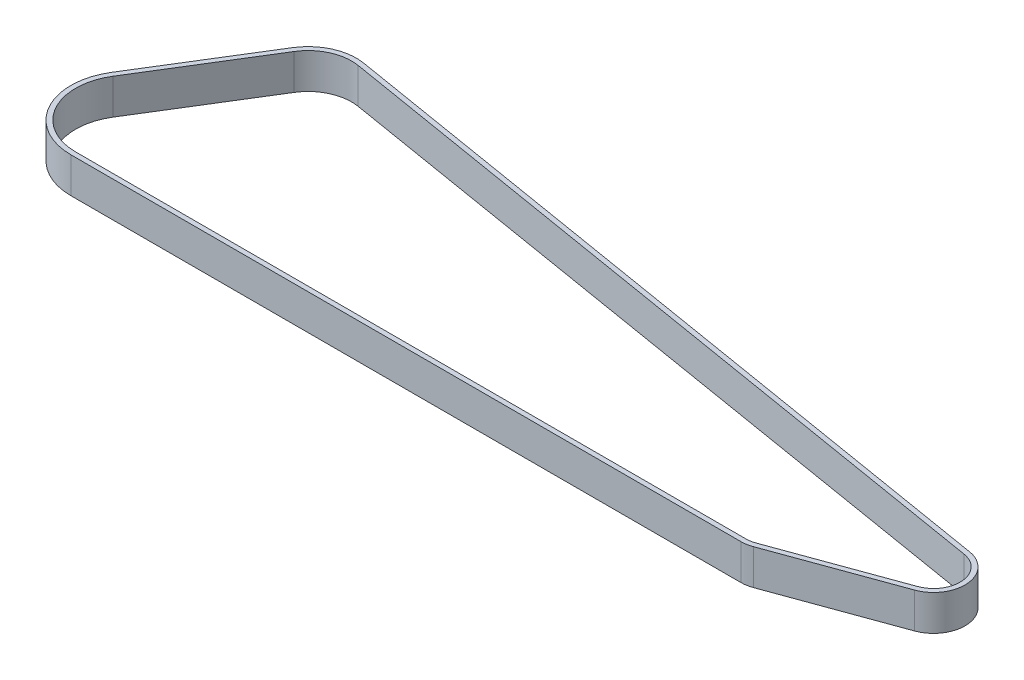
ISO-10303-21;
HEADER;
FILE_DESCRIPTION(('STEP AP214'),'2;1');
FILE_NAME('part.step','',(''),(''),'','','');
FILE_SCHEMA(('AUTOMOTIVE_DESIGN { 1 0 10303 214 1 1 1 1 }'));
ENDSEC;
DATA;
#1=APPLICATION_CONTEXT('core data for automotive mechanical design processes');
#2=APPLICATION_PROTOCOL_DEFINITION('international standard','automotive_design',2000,#1);
#3=PRODUCT_CONTEXT('',#1,'mechanical');
#4=PRODUCT('Part','Part','',(#3));
#5=PRODUCT_RELATED_PRODUCT_CATEGORY('part','',(#4));
#6=PRODUCT_DEFINITION_FORMATION('','',#4);
#7=PRODUCT_DEFINITION_CONTEXT('part definition',#1,'design');
#8=PRODUCT_DEFINITION('design','',#6,#7);
#9=PRODUCT_DEFINITION_SHAPE('','',#8);
#10=(LENGTH_UNIT() NAMED_UNIT(*) SI_UNIT(.MILLI.,.METRE.));
#11=(NAMED_UNIT(*) PLANE_ANGLE_UNIT() SI_UNIT($,.RADIAN.));
#12=(NAMED_UNIT(*) SI_UNIT($,.STERADIAN.) SOLID_ANGLE_UNIT());
#13=UNCERTAINTY_MEASURE_WITH_UNIT(LENGTH_MEASURE(1.E-05),#10,'distance_accuracy_value','');
#14=(GEOMETRIC_REPRESENTATION_CONTEXT(3) GLOBAL_UNCERTAINTY_ASSIGNED_CONTEXT((#13)) GLOBAL_UNIT_ASSIGNED_CONTEXT((#10,
#11,#12)) REPRESENTATION_CONTEXT('',''));
#15=CARTESIAN_POINT('',(0.,0.,0.));
#16=DIRECTION('',(0.,0.,1.));
#17=DIRECTION('',(1.,0.,0.));
#18=AXIS2_PLACEMENT_3D('',#15,#16,#17);
#19=CARTESIAN_POINT('',(-31.4527159951166,13.,-57.1021781318678));
#20=DIRECTION('',(-0.163389454989406,0.,0.98656164835162));
#21=DIRECTION('',(0.98656164835162,0.,0.163389454989406));
#22=AXIS2_PLACEMENT_3D('',#19,#20,#21);
#23=PLANE('',#22);
#24=DIRECTION('',(-0.98656164835162,0.,-0.163389454989406));
#25=VECTOR('',#24,1.);
#26=CARTESIAN_POINT('',(-31.4527159951166,4.,-57.1021781318678));
#27=LINE('',#26,#25);
#28=CARTESIAN_POINT('',(152.852878821178,4.,-26.5783981543595));
#29=VERTEX_POINT('',#28);
#30=CARTESIAN_POINT('',(-31.4474153331799,4.,-57.1013002624854));
#31=VERTEX_POINT('',#30);
#32=EDGE_CURVE('E156',#29,#31,#27,.T.);
#33=ORIENTED_EDGE('',*,*,#32,.F.);
#34=DIRECTION('',(0.,-1.,0.));
#35=VECTOR('',#34,1.);
#36=CARTESIAN_POINT('',(152.852878821178,13.,-26.5783981543595));
#37=LINE('',#36,#35);
#38=CARTESIAN_POINT('',(152.852878821178,13.,-26.5783981543595));
#39=VERTEX_POINT('',#38);
#40=EDGE_CURVE('E165',#39,#29,#37,.T.);
#41=ORIENTED_EDGE('',*,*,#40,.F.);
#42=DIRECTION('',(-0.98656164835162,0.,-0.163389454989406));
#43=VECTOR('',#42,1.);
#44=CARTESIAN_POINT('',(-31.4527159951166,13.,-57.1021781318678));
#45=LINE('',#44,#43);
#46=CARTESIAN_POINT('',(-31.4527159951166,13.,-57.1021781318678));
#47=VERTEX_POINT('',#46);
#48=EDGE_CURVE('E179',#39,#47,#45,.T.);
#49=ORIENTED_EDGE('',*,*,#48,.T.);
#50=DIRECTION('',(0.,-1.,0.));
#51=VECTOR('',#50,1.);
#52=CARTESIAN_POINT('',(-31.4527159951166,13.,-57.1021781318678));
#53=LINE('',#52,#51);
#54=CARTESIAN_POINT('',(-31.4527159951166,4.,-57.1021781318678));
#55=VERTEX_POINT('',#54);
#56=EDGE_CURVE('E175',#47,#55,#53,.T.);
#57=ORIENTED_EDGE('',*,*,#56,.T.);
#58=CARTESIAN_POINT('',(-33.25,4.,-46.25));
#59=DIRECTION('',(0.,1.,0.));
#60=DIRECTION('',(0.,0.,1.));
#61=AXIS2_PLACEMENT_3D('',#58,#59,#60);
#62=CIRCLE('',#61,11.);
#63=EDGE_CURVE('E162',#31,#55,#62,.T.);
#64=ORIENTED_EDGE('',*,*,#63,.F.);
#65=EDGE_LOOP('',(#33,#41,#49,#57,#64));
#66=FACE_BOUND('',#65,.T.);
#67=ADVANCED_FACE('F41',(#66),#23,.T.);
#68=CARTESIAN_POINT('',(-33.25,13.,-46.25));
#69=DIRECTION('',(0.,1.,0.));
#70=DIRECTION('',(0.,0.,1.));
#71=AXIS2_PLACEMENT_3D('',#68,#69,#70);
#72=PLANE('',#71);
#73=CARTESIAN_POINT('',(-33.25,13.,-46.25));
#74=DIRECTION('',(0.,1.,0.));
#75=DIRECTION('',(0.,0.,1.));
#76=AXIS2_PLACEMENT_3D('',#73,#74,#75);
#77=CIRCLE('',#76,12.23);
#78=CARTESIAN_POINT('',(-31.2517469654796,13.,-58.3156489593403));
#79=VERTEX_POINT('',#78);
#80=CARTESIAN_POINT('',(-43.6558013051858,13.,-52.6759006525929));
#81=VERTEX_POINT('',#80);
#82=EDGE_CURVE('E197',#79,#81,#77,.T.);
#83=ORIENTED_EDGE('',*,*,#82,.T.);
#84=DIRECTION('',(-0.525421149026402,0.,0.850842298052803));
#85=VECTOR('',#84,1.);
#86=CARTESIAN_POINT('',(-61.2083281993442,13.,-24.2521640996721));
#87=LINE('',#86,#85);
#88=CARTESIAN_POINT('',(-61.2083281993442,13.,-24.2521640996721));
#89=VERTEX_POINT('',#88);
#90=EDGE_CURVE('E200',#81,#89,#87,.T.);
#91=ORIENTED_EDGE('',*,*,#90,.T.);
#92=CARTESIAN_POINT('',(-48.25,13.,-16.25));
#93=DIRECTION('',(0.,1.,0.));
#94=DIRECTION('',(0.,0.,1.));
#95=AXIS2_PLACEMENT_3D('',#92,#93,#94);
#96=CIRCLE('',#95,15.23);
#97=CARTESIAN_POINT('',(-48.25,13.,-1.02));
#98=VERTEX_POINT('',#97);
#99=EDGE_CURVE('E202',#89,#98,#96,.T.);
#100=ORIENTED_EDGE('',*,*,#99,.T.);
#101=DIRECTION('',(1.,0.,0.));
#102=VECTOR('',#101,1.);
#103=CARTESIAN_POINT('',(-48.25,13.,-1.02));
#104=LINE('',#103,#102);
#105=CARTESIAN_POINT('',(121.75,13.,-1.01999999999996));
#106=VERTEX_POINT('',#105);
#107=EDGE_CURVE('E204',#98,#106,#104,.T.);
#108=ORIENTED_EDGE('',*,*,#107,.T.);
#109=CARTESIAN_POINT('',(121.75,13.,-9.));
#110=DIRECTION('',(0.,1.,0.));
#111=DIRECTION('',(0.,0.,1.));
#112=AXIS2_PLACEMENT_3D('',#109,#110,#111);
#113=CIRCLE('',#112,7.98000000000004);
#114=CARTESIAN_POINT('',(124.479320743739,13.,-1.50125288612843));
#115=VERTEX_POINT('',#114);
#116=EDGE_CURVE('E206',#106,#115,#113,.T.);
#117=ORIENTED_EDGE('',*,*,#116,.T.);
#118=DIRECTION('',(0.939692620785908,0.,-0.34202014332567));
#119=VECTOR('',#118,1.);
#120=CARTESIAN_POINT('',(154.479320743739,13.,-12.4203599141146));
#121=LINE('',#120,#119);
#122=CARTESIAN_POINT('',(154.479320743739,13.,-12.4203599141146));
#123=VERTEX_POINT('',#122);
#124=EDGE_CURVE('E208',#115,#123,#121,.T.);
#125=ORIENTED_EDGE('',*,*,#124,.T.);
#126=CARTESIAN_POINT('',(151.75,13.,-19.9191070279861));
#127=DIRECTION('',(0.,1.,0.));
#128=DIRECTION('',(0.,0.,1.));
#129=AXIS2_PLACEMENT_3D('',#126,#127,#128);
#130=CIRCLE('',#129,7.98000000000001);
#131=CARTESIAN_POINT('',(153.053847850816,13.,-27.791868981832));
#132=VERTEX_POINT('',#131);
#133=EDGE_CURVE('E210',#123,#132,#130,.T.);
#134=ORIENTED_EDGE('',*,*,#133,.T.);
#135=DIRECTION('',(-0.98656164835162,0.,-0.163389454989406));
#136=VECTOR('',#135,1.);
#137=CARTESIAN_POINT('',(-31.2517469654796,13.,-58.3156489593403));
#138=LINE('',#137,#136);
#139=EDGE_CURVE('E212',#132,#79,#138,.T.);
#140=ORIENTED_EDGE('',*,*,#139,.T.);
#141=EDGE_LOOP('',(#83,#91,#100,#108,#117,#125,#134,#140));
#142=FACE_BOUND('',#141,.T.);
#143=DIRECTION('',(-0.525421149026402,0.,0.850842298052804));
#144=VECTOR('',#143,1.);
#145=CARTESIAN_POINT('',(-60.1617921727393,13.,-23.6058960863696));
#146=LINE('',#145,#144);
#147=CARTESIAN_POINT('',(-42.6092652785808,13.,-52.0296326392904));
#148=VERTEX_POINT('',#147);
#149=CARTESIAN_POINT('',(-60.1617921727393,13.,-23.6058960863696));
#150=VERTEX_POINT('',#149);
#151=EDGE_CURVE('E263',#148,#150,#146,.T.);
#152=ORIENTED_EDGE('',*,*,#151,.F.);
#153=CARTESIAN_POINT('',(-33.25,13.,-46.25));
#154=DIRECTION('',(0.,1.,0.));
#155=DIRECTION('',(0.,0.,1.));
#156=AXIS2_PLACEMENT_3D('',#153,#154,#155);
#157=CIRCLE('',#156,11.);
#158=EDGE_CURVE('E261',#47,#148,#157,.T.);
#159=ORIENTED_EDGE('',*,*,#158,.F.);
#160=ORIENTED_EDGE('',*,*,#48,.F.);
#161=CARTESIAN_POINT('',(151.75,13.,-19.9191070279861));
#162=DIRECTION('',(0.,1.,0.));
#163=DIRECTION('',(0.,0.,1.));
#164=AXIS2_PLACEMENT_3D('',#161,#162,#163);
#165=CIRCLE('',#164,6.75000000000001);
#166=CARTESIAN_POINT('',(154.058635967448,13.,-13.5761818376812));
#167=VERTEX_POINT('',#166);
#168=EDGE_CURVE('E172',#167,#39,#165,.T.);
#169=ORIENTED_EDGE('',*,*,#168,.F.);
#170=DIRECTION('',(0.939692620785908,0.,-0.34202014332567));
#171=VECTOR('',#170,1.);
#172=CARTESIAN_POINT('',(154.058635967448,13.,-13.5761818376812));
#173=LINE('',#172,#171);
#174=CARTESIAN_POINT('',(124.058635967448,13.,-2.6570748096951));
#175=VERTEX_POINT('',#174);
#176=EDGE_CURVE('E276',#175,#167,#173,.T.);
#177=ORIENTED_EDGE('',*,*,#176,.F.);
#178=CARTESIAN_POINT('',(121.75,13.,-9.));
#179=DIRECTION('',(0.,1.,0.));
#180=DIRECTION('',(0.,0.,1.));
#181=AXIS2_PLACEMENT_3D('',#178,#179,#180);
#182=CIRCLE('',#181,6.75000000000001);
#183=CARTESIAN_POINT('',(121.75,13.,-2.24999999999999));
#184=VERTEX_POINT('',#183);
#185=EDGE_CURVE('E274',#184,#175,#182,.T.);
#186=ORIENTED_EDGE('',*,*,#185,.F.);
#187=DIRECTION('',(1.,0.,0.));
#188=VECTOR('',#187,1.);
#189=CARTESIAN_POINT('',(-48.25,13.,-2.25));
#190=LINE('',#189,#188);
#191=CARTESIAN_POINT('',(-48.25,13.,-2.25));
#192=VERTEX_POINT('',#191);
#193=EDGE_CURVE('E272',#192,#184,#190,.T.);
#194=ORIENTED_EDGE('',*,*,#193,.F.);
#195=CARTESIAN_POINT('',(-48.25,13.,-16.25));
#196=DIRECTION('',(0.,1.,0.));
#197=DIRECTION('',(0.,0.,1.));
#198=AXIS2_PLACEMENT_3D('',#195,#196,#197);
#199=CIRCLE('',#198,14.);
#200=EDGE_CURVE('E265',#150,#192,#199,.T.);
#201=ORIENTED_EDGE('',*,*,#200,.F.);
#202=EDGE_LOOP('',(#152,#159,#160,#169,#177,#186,#194,#201));
#203=FACE_BOUND('',#202,.T.);
#204=ADVANCED_FACE('F278',(#142,#203),#72,.T.);
#205=CARTESIAN_POINT('',(-33.25,13.,-46.25));
#206=DIRECTION('',(0.,-1.,0.));
#207=DIRECTION('',(0.,0.,-1.));
#208=AXIS2_PLACEMENT_3D('',#205,#206,#207);
#209=CYLINDRICAL_SURFACE('',#208,12.23);
#210=DIRECTION('',(0.,-1.,0.));
#211=VECTOR('',#210,1.);
#212=CARTESIAN_POINT('',(-31.2517469654796,13.,-58.3156489593403));
#213=LINE('',#212,#211);
#214=CARTESIAN_POINT('',(-31.2517469654796,4.,-58.3156489593403));
#215=VERTEX_POINT('',#214);
#216=EDGE_CURVE('E214',#79,#215,#213,.T.);
#217=ORIENTED_EDGE('',*,*,#216,.T.);
#218=CARTESIAN_POINT('',(-33.25,4.,-46.25));
#219=DIRECTION('',(0.,1.,0.));
#220=DIRECTION('',(0.,0.,1.));
#221=AXIS2_PLACEMENT_3D('',#218,#219,#220);
#222=CIRCLE('',#221,12.23);
#223=CARTESIAN_POINT('',(-43.6558013051858,4.,-52.6759006525929));
#224=VERTEX_POINT('',#223);
#225=EDGE_CURVE('E56',#215,#224,#222,.T.);
#226=ORIENTED_EDGE('',*,*,#225,.T.);
#227=DIRECTION('',(0.,-1.,0.));
#228=VECTOR('',#227,1.);
#229=CARTESIAN_POINT('',(-43.6558013051858,13.,-52.6759006525929));
#230=LINE('',#229,#228);
#231=EDGE_CURVE('E235',#81,#224,#230,.T.);
#232=ORIENTED_EDGE('',*,*,#231,.F.);
#233=ORIENTED_EDGE('',*,*,#82,.F.);
#234=EDGE_LOOP('',(#217,#226,#232,#233));
#235=FACE_BOUND('',#234,.T.);
#236=ADVANCED_FACE('F43',(#235),#209,.T.);
#237=CARTESIAN_POINT('',(-61.2083281993442,13.,-24.2521640996721));
#238=DIRECTION('',(0.850842298052804,0.,0.525421149026402));
#239=DIRECTION('',(0.525421149026402,0.,-0.850842298052804));
#240=AXIS2_PLACEMENT_3D('',#237,#238,#239);
#241=PLANE('',#240);
#242=ORIENTED_EDGE('',*,*,#231,.T.);
#243=DIRECTION('',(-0.525421149026402,0.,0.850842298052804));
#244=VECTOR('',#243,1.);
#245=CARTESIAN_POINT('',(-61.2083281993442,4.,-24.2521640996721));
#246=LINE('',#245,#244);
#247=CARTESIAN_POINT('',(-61.2083281993442,4.,-24.2521640996721));
#248=VERTEX_POINT('',#247);
#249=EDGE_CURVE('E267',#224,#248,#246,.T.);
#250=ORIENTED_EDGE('',*,*,#249,.T.);
#251=DIRECTION('',(0.,-1.,0.));
#252=VECTOR('',#251,1.);
#253=CARTESIAN_POINT('',(-61.2083281993442,13.,-24.2521640996721));
#254=LINE('',#253,#252);
#255=EDGE_CURVE('E232',#89,#248,#254,.T.);
#256=ORIENTED_EDGE('',*,*,#255,.F.);
#257=ORIENTED_EDGE('',*,*,#90,.F.);
#258=EDGE_LOOP('',(#242,#250,#256,#257));
#259=FACE_BOUND('',#258,.T.);
#260=ADVANCED_FACE('F417',(#259),#241,.F.);
#261=CARTESIAN_POINT('',(-48.25,13.,-16.25));
#262=DIRECTION('',(0.,-1.,0.));
#263=DIRECTION('',(0.,0.,-1.));
#264=AXIS2_PLACEMENT_3D('',#261,#262,#263);
#265=CYLINDRICAL_SURFACE('',#264,15.23);
#266=ORIENTED_EDGE('',*,*,#255,.T.);
#267=CARTESIAN_POINT('',(-48.25,4.,-16.25));
#268=DIRECTION('',(0.,1.,0.));
#269=DIRECTION('',(0.,0.,1.));
#270=AXIS2_PLACEMENT_3D('',#267,#268,#269);
#271=CIRCLE('',#270,15.23);
#272=CARTESIAN_POINT('',(-48.25,4.,-1.02));
#273=VERTEX_POINT('',#272);
#274=EDGE_CURVE('E238',#273,#248,#271,.F.);
#275=ORIENTED_EDGE('',*,*,#274,.F.);
#276=DIRECTION('',(0.,-1.,0.));
#277=VECTOR('',#276,1.);
#278=CARTESIAN_POINT('',(-48.25,13.,-1.02));
#279=LINE('',#278,#277);
#280=EDGE_CURVE('E229',#98,#273,#279,.T.);
#281=ORIENTED_EDGE('',*,*,#280,.F.);
#282=ORIENTED_EDGE('',*,*,#99,.F.);
#283=EDGE_LOOP('',(#266,#275,#281,#282));
#284=FACE_BOUND('',#283,.T.);
#285=ADVANCED_FACE('F408',(#284),#265,.T.);
#286=CARTESIAN_POINT('',(-48.25,13.,-1.02));
#287=DIRECTION('',(0.,0.,-1.));
#288=DIRECTION('',(-1.,0.,0.));
#289=AXIS2_PLACEMENT_3D('',#286,#287,#288);
#290=PLANE('',#289);
#291=DIRECTION('',(-1.,0.,0.));
#292=VECTOR('',#291,1.);
#293=CARTESIAN_POINT('',(0.,4.,-1.01999999999999));
#294=LINE('',#293,#292);
#295=CARTESIAN_POINT('',(121.75,4.,-1.01999999999996));
#296=VERTEX_POINT('',#295);
#297=EDGE_CURVE('E243',#296,#273,#294,.T.);
#298=ORIENTED_EDGE('',*,*,#297,.F.);
#299=DIRECTION('',(0.,-1.,0.));
#300=VECTOR('',#299,1.);
#301=CARTESIAN_POINT('',(121.75,13.,-1.01999999999996));
#302=LINE('',#301,#300);
#303=EDGE_CURVE('E226',#106,#296,#302,.T.);
#304=ORIENTED_EDGE('',*,*,#303,.F.);
#305=ORIENTED_EDGE('',*,*,#107,.F.);
#306=ORIENTED_EDGE('',*,*,#280,.T.);
#307=EDGE_LOOP('',(#298,#304,#305,#306));
#308=FACE_BOUND('',#307,.T.);
#309=ADVANCED_FACE('F399',(#308),#290,.F.);
#310=CARTESIAN_POINT('',(121.75,13.,-9.));
#311=DIRECTION('',(0.,-1.,0.));
#312=DIRECTION('',(0.,0.,-1.));
#313=AXIS2_PLACEMENT_3D('',#310,#311,#312);
#314=CYLINDRICAL_SURFACE('',#313,7.98000000000004);
#315=ORIENTED_EDGE('',*,*,#303,.T.);
#316=CARTESIAN_POINT('',(121.75,4.,-9.));
#317=DIRECTION('',(0.,1.,0.));
#318=DIRECTION('',(0.,0.,1.));
#319=AXIS2_PLACEMENT_3D('',#316,#317,#318);
#320=CIRCLE('',#319,7.98000000000004);
#321=CARTESIAN_POINT('',(124.479320743739,4.,-1.50125288612843));
#322=VERTEX_POINT('',#321);
#323=EDGE_CURVE('E467',#296,#322,#320,.T.);
#324=ORIENTED_EDGE('',*,*,#323,.T.);
#325=DIRECTION('',(0.,-1.,0.));
#326=VECTOR('',#325,1.);
#327=CARTESIAN_POINT('',(124.479320743739,13.,-1.50125288612843));
#328=LINE('',#327,#326);
#329=EDGE_CURVE('E223',#115,#322,#328,.T.);
#330=ORIENTED_EDGE('',*,*,#329,.F.);
#331=ORIENTED_EDGE('',*,*,#116,.F.);
#332=EDGE_LOOP('',(#315,#324,#330,#331));
#333=FACE_BOUND('',#332,.T.);
#334=ADVANCED_FACE('F390',(#333),#314,.T.);
#335=CARTESIAN_POINT('',(154.479320743739,13.,-12.4203599141146));
#336=DIRECTION('',(-0.34202014332567,0.,-0.939692620785908));
#337=DIRECTION('',(-0.939692620785908,0.,0.34202014332567));
#338=AXIS2_PLACEMENT_3D('',#335,#336,#337);
#339=PLANE('',#338);
#340=ORIENTED_EDGE('',*,*,#329,.T.);
#341=DIRECTION('',(0.939692620785908,0.,-0.34202014332567));
#342=VECTOR('',#341,1.);
#343=CARTESIAN_POINT('',(154.479320743739,4.,-12.4203599141146));
#344=LINE('',#343,#342);
#345=CARTESIAN_POINT('',(154.479320743739,4.,-12.4203599141146));
#346=VERTEX_POINT('',#345);
#347=EDGE_CURVE('E462',#322,#346,#344,.T.);
#348=ORIENTED_EDGE('',*,*,#347,.T.);
#349=DIRECTION('',(0.,-1.,0.));
#350=VECTOR('',#349,1.);
#351=CARTESIAN_POINT('',(154.479320743739,13.,-12.4203599141146));
#352=LINE('',#351,#350);
#353=EDGE_CURVE('E220',#123,#346,#352,.T.);
#354=ORIENTED_EDGE('',*,*,#353,.F.);
#355=ORIENTED_EDGE('',*,*,#124,.F.);
#356=EDGE_LOOP('',(#340,#348,#354,#355));
#357=FACE_BOUND('',#356,.T.);
#358=ADVANCED_FACE('F381',(#357),#339,.F.);
#359=CARTESIAN_POINT('',(151.75,13.,-19.9191070279861));
#360=DIRECTION('',(0.,-1.,0.));
#361=DIRECTION('',(0.,0.,-1.));
#362=AXIS2_PLACEMENT_3D('',#359,#360,#361);
#363=CYLINDRICAL_SURFACE('',#362,7.98000000000001);
#364=ORIENTED_EDGE('',*,*,#353,.T.);
#365=CARTESIAN_POINT('',(151.75,4.,-19.9191070279861));
#366=DIRECTION('',(0.,1.,0.));
#367=DIRECTION('',(0.,0.,1.));
#368=AXIS2_PLACEMENT_3D('',#365,#366,#367);
#369=CIRCLE('',#368,7.98000000000001);
#370=CARTESIAN_POINT('',(153.053847850816,4.,-27.791868981832));
#371=VERTEX_POINT('',#370);
#372=EDGE_CURVE('E460',#346,#371,#369,.T.);
#373=ORIENTED_EDGE('',*,*,#372,.T.);
#374=DIRECTION('',(0.,-1.,0.));
#375=VECTOR('',#374,1.);
#376=CARTESIAN_POINT('',(153.053847850816,13.,-27.791868981832));
#377=LINE('',#376,#375);
#378=EDGE_CURVE('E217',#132,#371,#377,.T.);
#379=ORIENTED_EDGE('',*,*,#378,.F.);
#380=ORIENTED_EDGE('',*,*,#133,.F.);
#381=EDGE_LOOP('',(#364,#373,#379,#380));
#382=FACE_BOUND('',#381,.T.);
#383=ADVANCED_FACE('F372',(#382),#363,.T.);
#384=CARTESIAN_POINT('',(-31.2517469654796,13.,-58.3156489593403));
#385=DIRECTION('',(-0.163389454989406,0.,0.98656164835162));
#386=DIRECTION('',(0.98656164835162,0.,0.163389454989406));
#387=AXIS2_PLACEMENT_3D('',#384,#385,#386);
#388=PLANE('',#387);
#389=ORIENTED_EDGE('',*,*,#378,.T.);
#390=DIRECTION('',(-0.98656164835162,0.,-0.163389454989406));
#391=VECTOR('',#390,1.);
#392=CARTESIAN_POINT('',(-31.2517469654796,4.,-58.3156489593403));
#393=LINE('',#392,#391);
#394=EDGE_CURVE('E168',#371,#215,#393,.T.);
#395=ORIENTED_EDGE('',*,*,#394,.T.);
#396=ORIENTED_EDGE('',*,*,#216,.F.);
#397=ORIENTED_EDGE('',*,*,#139,.F.);
#398=EDGE_LOOP('',(#389,#395,#396,#397));
#399=FACE_BOUND('',#398,.T.);
#400=ADVANCED_FACE('F364',(#399),#388,.F.);
#401=CARTESIAN_POINT('',(-33.25,13.,-46.25));
#402=DIRECTION('',(0.,-1.,0.));
#403=DIRECTION('',(0.,0.,-1.));
#404=AXIS2_PLACEMENT_3D('',#401,#402,#403);
#405=CYLINDRICAL_SURFACE('',#404,11.);
#406=DIRECTION('',(0.,-1.,0.));
#407=VECTOR('',#406,1.);
#408=CARTESIAN_POINT('',(-42.6092652785808,13.,-52.0296326392904));
#409=LINE('',#408,#407);
#410=CARTESIAN_POINT('',(-42.6092652785808,4.,-52.0296326392904));
#411=VERTEX_POINT('',#410);
#412=EDGE_CURVE('E194',#148,#411,#409,.T.);
#413=ORIENTED_EDGE('',*,*,#412,.T.);
#414=CARTESIAN_POINT('',(-33.25,4.,-46.25));
#415=DIRECTION('',(0.,1.,0.));
#416=DIRECTION('',(0.,0.,1.));
#417=AXIS2_PLACEMENT_3D('',#414,#415,#416);
#418=CIRCLE('',#417,11.);
#419=EDGE_CURVE('E240',#411,#55,#418,.F.);
#420=ORIENTED_EDGE('',*,*,#419,.T.);
#421=ORIENTED_EDGE('',*,*,#56,.F.);
#422=ORIENTED_EDGE('',*,*,#158,.T.);
#423=EDGE_LOOP('',(#413,#420,#421,#422));
#424=FACE_BOUND('',#423,.T.);
#425=ADVANCED_FACE('F258',(#424),#405,.F.);
#426=CARTESIAN_POINT('',(-60.1617921727393,13.,-23.6058960863696));
#427=DIRECTION('',(0.850842298052804,0.,0.525421149026402));
#428=DIRECTION('',(0.525421149026402,0.,-0.850842298052804));
#429=AXIS2_PLACEMENT_3D('',#426,#427,#428);
#430=PLANE('',#429);
#431=DIRECTION('',(0.,-1.,0.));
#432=VECTOR('',#431,1.);
#433=CARTESIAN_POINT('',(-60.1617921727393,13.,-23.6058960863696));
#434=LINE('',#433,#432);
#435=CARTESIAN_POINT('',(-60.1617921727393,4.,-23.6058960863696));
#436=VERTEX_POINT('',#435);
#437=EDGE_CURVE('E191',#150,#436,#434,.T.);
#438=ORIENTED_EDGE('',*,*,#437,.T.);
#439=DIRECTION('',(0.525421149026402,0.,-0.850842298052804));
#440=VECTOR('',#439,1.);
#441=CARTESIAN_POINT('',(-54.1061121428569,4.,-33.4121795267011));
#442=LINE('',#441,#440);
#443=EDGE_CURVE('E49',#436,#411,#442,.T.);
#444=ORIENTED_EDGE('',*,*,#443,.T.);
#445=ORIENTED_EDGE('',*,*,#412,.F.);
#446=ORIENTED_EDGE('',*,*,#151,.T.);
#447=EDGE_LOOP('',(#438,#444,#445,#446));
#448=FACE_BOUND('',#447,.T.);
#449=ADVANCED_FACE('F253',(#448),#430,.T.);
#450=CARTESIAN_POINT('',(-48.25,13.,-16.25));
#451=DIRECTION('',(0.,-1.,0.));
#452=DIRECTION('',(0.,0.,-1.));
#453=AXIS2_PLACEMENT_3D('',#450,#451,#452);
#454=CYLINDRICAL_SURFACE('',#453,14.);
#455=DIRECTION('',(0.,-1.,0.));
#456=VECTOR('',#455,1.);
#457=CARTESIAN_POINT('',(-48.25,13.,-2.25));
#458=LINE('',#457,#456);
#459=CARTESIAN_POINT('',(-48.25,4.,-2.25));
#460=VERTEX_POINT('',#459);
#461=EDGE_CURVE('E188',#192,#460,#458,.T.);
#462=ORIENTED_EDGE('',*,*,#461,.T.);
#463=CARTESIAN_POINT('',(-48.25,4.,-16.25));
#464=DIRECTION('',(0.,1.,0.));
#465=DIRECTION('',(0.,0.,1.));
#466=AXIS2_PLACEMENT_3D('',#463,#464,#465);
#467=CIRCLE('',#466,14.);
#468=EDGE_CURVE('E11',#436,#460,#467,.T.);
#469=ORIENTED_EDGE('',*,*,#468,.F.);
#470=ORIENTED_EDGE('',*,*,#437,.F.);
#471=ORIENTED_EDGE('',*,*,#200,.T.);
#472=EDGE_LOOP('',(#462,#469,#470,#471));
#473=FACE_BOUND('',#472,.T.);
#474=ADVANCED_FACE('F295',(#473),#454,.F.);
#475=CARTESIAN_POINT('',(-48.25,13.,-2.25));
#476=DIRECTION('',(0.,0.,-1.));
#477=DIRECTION('',(-1.,0.,0.));
#478=AXIS2_PLACEMENT_3D('',#475,#476,#477);
#479=PLANE('',#478);
#480=DIRECTION('',(0.,-1.,0.));
#481=VECTOR('',#480,1.);
#482=CARTESIAN_POINT('',(121.75,13.,-2.24999999999999));
#483=LINE('',#482,#481);
#484=CARTESIAN_POINT('',(121.75,4.,-2.24999999999999));
#485=VERTEX_POINT('',#484);
#486=EDGE_CURVE('E185',#184,#485,#483,.T.);
#487=ORIENTED_EDGE('',*,*,#486,.T.);
#488=DIRECTION('',(1.,0.,0.));
#489=VECTOR('',#488,1.);
#490=CARTESIAN_POINT('',(0.,4.,-2.25));
#491=LINE('',#490,#489);
#492=EDGE_CURVE('E245',#460,#485,#491,.T.);
#493=ORIENTED_EDGE('',*,*,#492,.F.);
#494=ORIENTED_EDGE('',*,*,#461,.F.);
#495=ORIENTED_EDGE('',*,*,#193,.T.);
#496=EDGE_LOOP('',(#487,#493,#494,#495));
#497=FACE_BOUND('',#496,.T.);
#498=ADVANCED_FACE('F291',(#497),#479,.T.);
#499=CARTESIAN_POINT('',(121.75,13.,-9.));
#500=DIRECTION('',(0.,-1.,0.));
#501=DIRECTION('',(0.,0.,-1.));
#502=AXIS2_PLACEMENT_3D('',#499,#500,#501);
#503=CYLINDRICAL_SURFACE('',#502,6.75000000000001);
#504=DIRECTION('',(0.,-1.,0.));
#505=VECTOR('',#504,1.);
#506=CARTESIAN_POINT('',(124.058635967448,13.,-2.6570748096951));
#507=LINE('',#506,#505);
#508=CARTESIAN_POINT('',(124.058635967448,4.,-2.6570748096951));
#509=VERTEX_POINT('',#508);
#510=EDGE_CURVE('E177',#175,#509,#507,.T.);
#511=ORIENTED_EDGE('',*,*,#510,.T.);
#512=CARTESIAN_POINT('',(121.75,4.,-9.));
#513=DIRECTION('',(0.,1.,0.));
#514=DIRECTION('',(0.,0.,1.));
#515=AXIS2_PLACEMENT_3D('',#512,#513,#514);
#516=CIRCLE('',#515,6.75);
#517=EDGE_CURVE('E247',#485,#509,#516,.T.);
#518=ORIENTED_EDGE('',*,*,#517,.F.);
#519=ORIENTED_EDGE('',*,*,#486,.F.);
#520=ORIENTED_EDGE('',*,*,#185,.T.);
#521=EDGE_LOOP('',(#511,#518,#519,#520));
#522=FACE_BOUND('',#521,.T.);
#523=ADVANCED_FACE('F287',(#522),#503,.F.);
#524=CARTESIAN_POINT('',(154.058635967448,13.,-13.5761818376812));
#525=DIRECTION('',(-0.34202014332567,0.,-0.939692620785908));
#526=DIRECTION('',(-0.939692620785908,0.,0.34202014332567));
#527=AXIS2_PLACEMENT_3D('',#524,#525,#526);
#528=PLANE('',#527);
#529=DIRECTION('',(0.,-1.,0.));
#530=VECTOR('',#529,1.);
#531=CARTESIAN_POINT('',(154.058635967448,13.,-13.5761818376812));
#532=LINE('',#531,#530);
#533=CARTESIAN_POINT('',(154.058635967448,4.,-13.5761818376812));
#534=VERTEX_POINT('',#533);
#535=EDGE_CURVE('E174',#167,#534,#532,.T.);
#536=ORIENTED_EDGE('',*,*,#535,.T.);
#537=DIRECTION('',(0.939692620785908,0.,-0.342020143325669));
#538=VECTOR('',#537,1.);
#539=CARTESIAN_POINT('',(13.6581362489911,4.,37.5254209359376));
#540=LINE('',#539,#538);
#541=EDGE_CURVE('E64',#509,#534,#540,.T.);
#542=ORIENTED_EDGE('',*,*,#541,.F.);
#543=ORIENTED_EDGE('',*,*,#510,.F.);
#544=ORIENTED_EDGE('',*,*,#176,.T.);
#545=EDGE_LOOP('',(#536,#542,#543,#544));
#546=FACE_BOUND('',#545,.T.);
#547=ADVANCED_FACE('F284',(#546),#528,.T.);
#548=CARTESIAN_POINT('',(151.75,13.,-19.9191070279861));
#549=DIRECTION('',(0.,-1.,0.));
#550=DIRECTION('',(0.,0.,-1.));
#551=AXIS2_PLACEMENT_3D('',#548,#549,#550);
#552=CYLINDRICAL_SURFACE('',#551,6.75000000000001);
#553=ORIENTED_EDGE('',*,*,#40,.T.);
#554=CARTESIAN_POINT('',(151.75,4.,-19.9191070279861));
#555=DIRECTION('',(0.,1.,0.));
#556=DIRECTION('',(0.,0.,1.));
#557=AXIS2_PLACEMENT_3D('',#554,#555,#556);
#558=CIRCLE('',#557,6.75);
#559=EDGE_CURVE('E153',#534,#29,#558,.T.);
#560=ORIENTED_EDGE('',*,*,#559,.F.);
#561=ORIENTED_EDGE('',*,*,#535,.F.);
#562=ORIENTED_EDGE('',*,*,#168,.T.);
#563=EDGE_LOOP('',(#553,#560,#561,#562));
#564=FACE_BOUND('',#563,.T.);
#565=ADVANCED_FACE('F170',(#564),#552,.F.);
#566=CARTESIAN_POINT('',(0.,4.,0.));
#567=DIRECTION('',(0.,1.,0.));
#568=DIRECTION('',(0.,0.,1.));
#569=AXIS2_PLACEMENT_3D('',#566,#567,#568);
#570=PLANE('',#569);
#571=ORIENTED_EDGE('',*,*,#32,.T.);
#572=ORIENTED_EDGE('',*,*,#63,.T.);
#573=ORIENTED_EDGE('',*,*,#419,.F.);
#574=ORIENTED_EDGE('',*,*,#443,.F.);
#575=ORIENTED_EDGE('',*,*,#468,.T.);
#576=ORIENTED_EDGE('',*,*,#492,.T.);
#577=ORIENTED_EDGE('',*,*,#517,.T.);
#578=ORIENTED_EDGE('',*,*,#541,.T.);
#579=ORIENTED_EDGE('',*,*,#559,.T.);
#580=EDGE_LOOP('',(#571,#572,#573,#574,#575,#576,#577,#578,#579));
#581=FACE_BOUND('',#580,.T.);
#582=ORIENTED_EDGE('',*,*,#394,.F.);
#583=ORIENTED_EDGE('',*,*,#372,.F.);
#584=ORIENTED_EDGE('',*,*,#347,.F.);
#585=ORIENTED_EDGE('',*,*,#323,.F.);
#586=ORIENTED_EDGE('',*,*,#297,.T.);
#587=ORIENTED_EDGE('',*,*,#274,.T.);
#588=ORIENTED_EDGE('',*,*,#249,.F.);
#589=ORIENTED_EDGE('',*,*,#225,.F.);
#590=EDGE_LOOP('',(#582,#583,#584,#585,#586,#587,#588,#589));
#591=FACE_BOUND('',#590,.T.);
#592=ADVANCED_FACE('F155',(#581,#591),#570,.F.);
#593=CLOSED_SHELL('',(#67,#204,#236,#260,#285,#309,#334,#358,#383,#400,#425,#449,#474,#498,#523,
#547,#565,#592));
#594=MANIFOLD_SOLID_BREP('B2',#593);
#595=ADVANCED_BREP_SHAPE_REPRESENTATION('',(#18,#594),#14);
#596=SHAPE_DEFINITION_REPRESENTATION(#9,#595);
ENDSEC;
END-ISO-10303-21;
